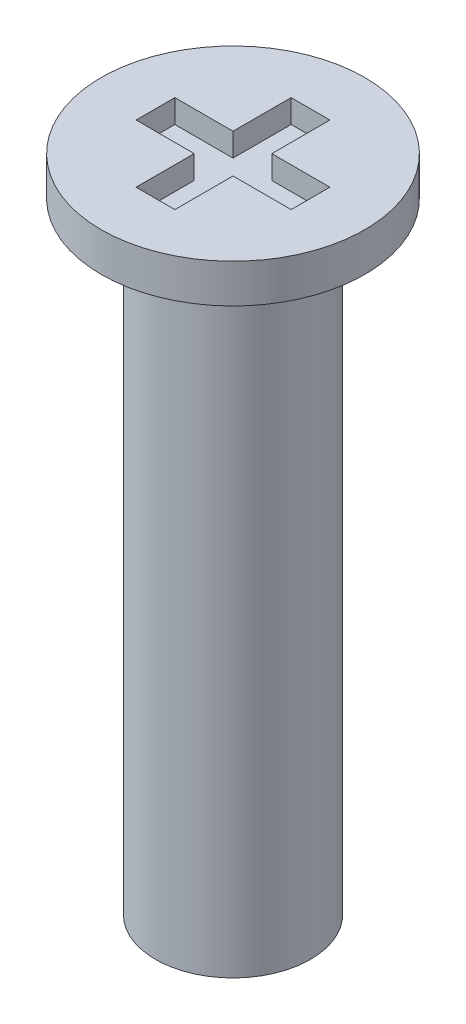
ISO-10303-21;
HEADER;
FILE_DESCRIPTION(('STEP AP214'),'2;1');
FILE_NAME('part.step','',(''),(''),'','','');
FILE_SCHEMA(('AUTOMOTIVE_DESIGN { 1 0 10303 214 1 1 1 1 }'));
ENDSEC;
DATA;
#1=APPLICATION_CONTEXT('core data for automotive mechanical design processes');
#2=APPLICATION_PROTOCOL_DEFINITION('international standard','automotive_design',2000,#1);
#3=PRODUCT_CONTEXT('',#1,'mechanical');
#4=PRODUCT('Part','Part','',(#3));
#5=PRODUCT_RELATED_PRODUCT_CATEGORY('part','',(#4));
#6=PRODUCT_DEFINITION_FORMATION('','',#4);
#7=PRODUCT_DEFINITION_CONTEXT('part definition',#1,'design');
#8=PRODUCT_DEFINITION('design','',#6,#7);
#9=PRODUCT_DEFINITION_SHAPE('','',#8);
#10=(LENGTH_UNIT() NAMED_UNIT(*) SI_UNIT(.MILLI.,.METRE.));
#11=(NAMED_UNIT(*) PLANE_ANGLE_UNIT() SI_UNIT($,.RADIAN.));
#12=(NAMED_UNIT(*) SI_UNIT($,.STERADIAN.) SOLID_ANGLE_UNIT());
#13=UNCERTAINTY_MEASURE_WITH_UNIT(LENGTH_MEASURE(1.E-05),#10,'distance_accuracy_value','');
#14=(GEOMETRIC_REPRESENTATION_CONTEXT(3) GLOBAL_UNCERTAINTY_ASSIGNED_CONTEXT((#13)) GLOBAL_UNIT_ASSIGNED_CONTEXT((#10,
#11,#12)) REPRESENTATION_CONTEXT('',''));
#15=CARTESIAN_POINT('',(0.,0.,0.));
#16=DIRECTION('',(0.,0.,1.));
#17=DIRECTION('',(1.,0.,0.));
#18=AXIS2_PLACEMENT_3D('',#15,#16,#17);
#19=CARTESIAN_POINT('',(0.,0.,0.));
#20=DIRECTION('',(0.,1.,0.));
#21=DIRECTION('',(0.,0.,1.));
#22=AXIS2_PLACEMENT_3D('',#19,#20,#21);
#23=PLANE('',#22);
#24=DIRECTION('',(-1.,0.,0.));
#25=VECTOR('',#24,1.);
#26=CARTESIAN_POINT('',(0.,0.,-0.25));
#27=LINE('',#26,#25);
#28=CARTESIAN_POINT('',(1.,0.,-0.249999999999997));
#29=VERTEX_POINT('',#28);
#30=CARTESIAN_POINT('',(0.25,0.,-0.249999999999999));
#31=VERTEX_POINT('',#30);
#32=EDGE_CURVE('E198',#29,#31,#27,.T.);
#33=ORIENTED_EDGE('',*,*,#32,.F.);
#34=DIRECTION('',(0.,0.,-1.));
#35=VECTOR('',#34,1.);
#36=CARTESIAN_POINT('',(1.,0.,-0.249999999999997));
#37=LINE('',#36,#35);
#38=CARTESIAN_POINT('',(0.999999999999999,0.,0.250000000000003));
#39=VERTEX_POINT('',#38);
#40=EDGE_CURVE('E144',#39,#29,#37,.T.);
#41=ORIENTED_EDGE('',*,*,#40,.F.);
#42=DIRECTION('',(1.,0.,0.));
#43=VECTOR('',#42,1.);
#44=CARTESIAN_POINT('',(0.,0.,0.25));
#45=LINE('',#44,#43);
#46=CARTESIAN_POINT('',(0.25,0.,0.250000000000003));
#47=VERTEX_POINT('',#46);
#48=EDGE_CURVE('E200',#47,#39,#45,.T.);
#49=ORIENTED_EDGE('',*,*,#48,.F.);
#50=DIRECTION('',(0.,0.,-1.));
#51=VECTOR('',#50,1.);
#52=CARTESIAN_POINT('',(0.25,0.,0.));
#53=LINE('',#52,#51);
#54=CARTESIAN_POINT('',(0.25,0.,1.));
#55=VERTEX_POINT('',#54);
#56=EDGE_CURVE('E170',#55,#47,#53,.T.);
#57=ORIENTED_EDGE('',*,*,#56,.F.);
#58=DIRECTION('',(1.,0.,0.));
#59=VECTOR('',#58,1.);
#60=CARTESIAN_POINT('',(0.25,0.,1.));
#61=LINE('',#60,#59);
#62=CARTESIAN_POINT('',(-0.25,0.,1.));
#63=VERTEX_POINT('',#62);
#64=EDGE_CURVE('E174',#63,#55,#61,.T.);
#65=ORIENTED_EDGE('',*,*,#64,.F.);
#66=DIRECTION('',(0.,0.,1.));
#67=VECTOR('',#66,1.);
#68=CARTESIAN_POINT('',(-0.25,0.,0.));
#69=LINE('',#68,#67);
#70=CARTESIAN_POINT('',(-0.25,0.,0.249999999999998));
#71=VERTEX_POINT('',#70);
#72=EDGE_CURVE('E182',#71,#63,#69,.T.);
#73=ORIENTED_EDGE('',*,*,#72,.F.);
#74=DIRECTION('',(1.,0.,0.));
#75=VECTOR('',#74,1.);
#76=CARTESIAN_POINT('',(0.,0.,0.25));
#77=LINE('',#76,#75);
#78=CARTESIAN_POINT('',(-1.,0.,0.24999999999999));
#79=VERTEX_POINT('',#78);
#80=EDGE_CURVE('E163',#79,#71,#77,.T.);
#81=ORIENTED_EDGE('',*,*,#80,.F.);
#82=DIRECTION('',(0.,0.,1.));
#83=VECTOR('',#82,1.);
#84=CARTESIAN_POINT('',(-1.,0.,0.24999999999999));
#85=LINE('',#84,#83);
#86=CARTESIAN_POINT('',(-0.999999999999997,0.,-0.25000000000001));
#87=VERTEX_POINT('',#86);
#88=EDGE_CURVE('E160',#87,#79,#85,.T.);
#89=ORIENTED_EDGE('',*,*,#88,.F.);
#90=CARTESIAN_POINT('',(-0.25,0.,-0.250000000000001));
#91=VERTEX_POINT('',#90);
#92=EDGE_CURVE('E150',#91,#87,#27,.T.);
#93=ORIENTED_EDGE('',*,*,#92,.F.);
#94=DIRECTION('',(0.,0.,1.));
#95=VECTOR('',#94,1.);
#96=CARTESIAN_POINT('',(-0.25,0.,0.));
#97=LINE('',#96,#95);
#98=CARTESIAN_POINT('',(-0.25,0.,-1.));
#99=VERTEX_POINT('',#98);
#100=EDGE_CURVE('E212',#99,#91,#97,.T.);
#101=ORIENTED_EDGE('',*,*,#100,.F.);
#102=DIRECTION('',(-1.,0.,0.));
#103=VECTOR('',#102,1.);
#104=CARTESIAN_POINT('',(-0.25,0.,-1.));
#105=LINE('',#104,#103);
#106=CARTESIAN_POINT('',(0.25,0.,-1.));
#107=VERTEX_POINT('',#106);
#108=EDGE_CURVE('E215',#107,#99,#105,.T.);
#109=ORIENTED_EDGE('',*,*,#108,.F.);
#110=DIRECTION('',(0.,0.,-1.));
#111=VECTOR('',#110,1.);
#112=CARTESIAN_POINT('',(0.25,0.,0.));
#113=LINE('',#112,#111);
#114=EDGE_CURVE('E70',#31,#107,#113,.T.);
#115=ORIENTED_EDGE('',*,*,#114,.F.);
#116=EDGE_LOOP('',(#33,#41,#49,#57,#65,#73,#81,#89,#93,#101,#109,#115));
#117=FACE_BOUND('',#116,.T.);
#118=CARTESIAN_POINT('',(0.,0.,0.));
#119=DIRECTION('',(0.,-1.,0.));
#120=DIRECTION('',(0.,0.,-1.));
#121=AXIS2_PLACEMENT_3D('',#118,#119,#120);
#122=CIRCLE('',#121,1.7);
#123=CARTESIAN_POINT('',(0.,0.,-1.7));
#124=VERTEX_POINT('',#123);
#125=EDGE_CURVE('E11',#124,#124,#122,.T.);
#126=ORIENTED_EDGE('',*,*,#125,.F.);
#127=EDGE_LOOP('',(#126));
#128=FACE_BOUND('',#127,.T.);
#129=ADVANCED_FACE('F42',(#117,#128),#23,.T.);
#130=CARTESIAN_POINT('',(0.,-8.5,0.));
#131=DIRECTION('',(0.,-1.,0.));
#132=DIRECTION('',(0.,0.,-1.));
#133=AXIS2_PLACEMENT_3D('',#130,#131,#132);
#134=CYLINDRICAL_SURFACE('',#133,1.7);
#135=ORIENTED_EDGE('',*,*,#125,.T.);
#136=EDGE_LOOP('',(#135));
#137=FACE_BOUND('',#136,.T.);
#138=CARTESIAN_POINT('',(0.,-0.5,0.));
#139=DIRECTION('',(0.,-1.,0.));
#140=DIRECTION('',(0.,0.,-1.));
#141=AXIS2_PLACEMENT_3D('',#138,#139,#140);
#142=CIRCLE('',#141,1.7);
#143=CARTESIAN_POINT('',(0.,-0.5,-1.7));
#144=VERTEX_POINT('',#143);
#145=EDGE_CURVE('E50',#144,#144,#142,.T.);
#146=ORIENTED_EDGE('',*,*,#145,.F.);
#147=EDGE_LOOP('',(#146));
#148=FACE_BOUND('',#147,.T.);
#149=ADVANCED_FACE('F237',(#137,#148),#134,.T.);
#150=CARTESIAN_POINT('',(1.7,-0.5,0.));
#151=DIRECTION('',(0.,-1.,0.));
#152=DIRECTION('',(0.,0.,-1.));
#153=AXIS2_PLACEMENT_3D('',#150,#151,#152);
#154=PLANE('',#153);
#155=ORIENTED_EDGE('',*,*,#145,.T.);
#156=EDGE_LOOP('',(#155));
#157=FACE_BOUND('',#156,.T.);
#158=CARTESIAN_POINT('',(0.,-0.5,0.));
#159=DIRECTION('',(0.,-1.,0.));
#160=DIRECTION('',(0.,0.,-1.));
#161=AXIS2_PLACEMENT_3D('',#158,#159,#160);
#162=CIRCLE('',#161,1.);
#163=CARTESIAN_POINT('',(0.,-0.5,-1.));
#164=VERTEX_POINT('',#163);
#165=EDGE_CURVE('E229',#164,#164,#162,.T.);
#166=ORIENTED_EDGE('',*,*,#165,.F.);
#167=EDGE_LOOP('',(#166));
#168=FACE_BOUND('',#167,.T.);
#169=ADVANCED_FACE('F234',(#157,#168),#154,.T.);
#170=CARTESIAN_POINT('',(0.,-8.5,0.));
#171=DIRECTION('',(0.,-1.,0.));
#172=DIRECTION('',(0.,0.,-1.));
#173=AXIS2_PLACEMENT_3D('',#170,#171,#172);
#174=CYLINDRICAL_SURFACE('',#173,1.);
#175=ORIENTED_EDGE('',*,*,#165,.T.);
#176=EDGE_LOOP('',(#175));
#177=FACE_BOUND('',#176,.T.);
#178=CARTESIAN_POINT('',(0.,-8.5,0.));
#179=DIRECTION('',(0.,-1.,0.));
#180=DIRECTION('',(0.,0.,-1.));
#181=AXIS2_PLACEMENT_3D('',#178,#179,#180);
#182=CIRCLE('',#181,1.);
#183=CARTESIAN_POINT('',(0.,-8.5,-1.));
#184=VERTEX_POINT('',#183);
#185=EDGE_CURVE('E225',#184,#184,#182,.T.);
#186=ORIENTED_EDGE('',*,*,#185,.F.);
#187=EDGE_LOOP('',(#186));
#188=FACE_BOUND('',#187,.T.);
#189=ADVANCED_FACE('F244',(#177,#188),#174,.T.);
#190=CARTESIAN_POINT('',(1.,-8.5,0.));
#191=DIRECTION('',(0.,-1.,0.));
#192=DIRECTION('',(0.,0.,-1.));
#193=AXIS2_PLACEMENT_3D('',#190,#191,#192);
#194=PLANE('',#193);
#195=ORIENTED_EDGE('',*,*,#185,.T.);
#196=EDGE_LOOP('',(#195));
#197=FACE_BOUND('',#196,.T.);
#198=ADVANCED_FACE('F250',(#197),#194,.T.);
#199=CARTESIAN_POINT('',(-0.25,-0.3,0.));
#200=DIRECTION('',(-1.,0.,0.));
#201=DIRECTION('',(0.,-1.,0.));
#202=AXIS2_PLACEMENT_3D('',#199,#200,#201);
#203=PLANE('',#202);
#204=ORIENTED_EDGE('',*,*,#100,.T.);
#205=DIRECTION('',(0.,-1.,0.));
#206=VECTOR('',#205,1.);
#207=CARTESIAN_POINT('',(-0.25,-0.3,-0.250000000000001));
#208=LINE('',#207,#206);
#209=CARTESIAN_POINT('',(-0.25,-0.3,-0.250000000000001));
#210=VERTEX_POINT('',#209);
#211=EDGE_CURVE('E210',#91,#210,#208,.T.);
#212=ORIENTED_EDGE('',*,*,#211,.T.);
#213=DIRECTION('',(0.,0.,1.));
#214=VECTOR('',#213,1.);
#215=CARTESIAN_POINT('',(-0.25,-0.3,0.));
#216=LINE('',#215,#214);
#217=CARTESIAN_POINT('',(-0.25,-0.3,-1.));
#218=VERTEX_POINT('',#217);
#219=EDGE_CURVE('E142',#218,#210,#216,.T.);
#220=ORIENTED_EDGE('',*,*,#219,.F.);
#221=DIRECTION('',(0.,1.,0.));
#222=VECTOR('',#221,1.);
#223=CARTESIAN_POINT('',(-0.25,-0.3,-1.));
#224=LINE('',#223,#222);
#225=EDGE_CURVE('E58',#218,#99,#224,.T.);
#226=ORIENTED_EDGE('',*,*,#225,.T.);
#227=EDGE_LOOP('',(#204,#212,#220,#226));
#228=FACE_BOUND('',#227,.T.);
#229=ADVANCED_FACE('F254',(#228),#203,.F.);
#230=CARTESIAN_POINT('',(-0.25,-0.3,-1.));
#231=DIRECTION('',(0.,0.,-1.));
#232=DIRECTION('',(-1.,0.,0.));
#233=AXIS2_PLACEMENT_3D('',#230,#231,#232);
#234=PLANE('',#233);
#235=ORIENTED_EDGE('',*,*,#108,.T.);
#236=ORIENTED_EDGE('',*,*,#225,.F.);
#237=DIRECTION('',(-1.,0.,0.));
#238=VECTOR('',#237,1.);
#239=CARTESIAN_POINT('',(-0.25,-0.3,-1.));
#240=LINE('',#239,#238);
#241=CARTESIAN_POINT('',(0.25,-0.3,-1.));
#242=VERTEX_POINT('',#241);
#243=EDGE_CURVE('E217',#242,#218,#240,.T.);
#244=ORIENTED_EDGE('',*,*,#243,.F.);
#245=DIRECTION('',(0.,1.,0.));
#246=VECTOR('',#245,1.);
#247=CARTESIAN_POINT('',(0.25,-0.3,-1.));
#248=LINE('',#247,#246);
#249=EDGE_CURVE('E219',#242,#107,#248,.T.);
#250=ORIENTED_EDGE('',*,*,#249,.T.);
#251=EDGE_LOOP('',(#235,#236,#244,#250));
#252=FACE_BOUND('',#251,.T.);
#253=ADVANCED_FACE('F258',(#252),#234,.F.);
#254=CARTESIAN_POINT('',(0.25,-0.3,0.));
#255=DIRECTION('',(1.,0.,0.));
#256=DIRECTION('',(0.,1.,0.));
#257=AXIS2_PLACEMENT_3D('',#254,#255,#256);
#258=PLANE('',#257);
#259=DIRECTION('',(0.,0.,-1.));
#260=VECTOR('',#259,1.);
#261=CARTESIAN_POINT('',(0.25,-0.3,0.));
#262=LINE('',#261,#260);
#263=CARTESIAN_POINT('',(0.25,-0.3,-0.249999999999999));
#264=VERTEX_POINT('',#263);
#265=EDGE_CURVE('E214',#264,#242,#262,.T.);
#266=ORIENTED_EDGE('',*,*,#265,.F.);
#267=DIRECTION('',(0.,1.,0.));
#268=VECTOR('',#267,1.);
#269=CARTESIAN_POINT('',(0.25,-0.3,-0.249999999999999));
#270=LINE('',#269,#268);
#271=EDGE_CURVE('E206',#264,#31,#270,.T.);
#272=ORIENTED_EDGE('',*,*,#271,.T.);
#273=ORIENTED_EDGE('',*,*,#114,.T.);
#274=ORIENTED_EDGE('',*,*,#249,.F.);
#275=EDGE_LOOP('',(#266,#272,#273,#274));
#276=FACE_BOUND('',#275,.T.);
#277=ADVANCED_FACE('F260',(#276),#258,.F.);
#278=CARTESIAN_POINT('',(0.,-0.3,0.));
#279=DIRECTION('',(0.,-1.,0.));
#280=DIRECTION('',(1.,0.,0.));
#281=AXIS2_PLACEMENT_3D('',#278,#279,#280);
#282=PLANE('',#281);
#283=DIRECTION('',(-1.,0.,0.));
#284=VECTOR('',#283,1.);
#285=CARTESIAN_POINT('',(0.,-0.3,-0.25));
#286=LINE('',#285,#284);
#287=CARTESIAN_POINT('',(1.,-0.3,-0.249999999999997));
#288=VERTEX_POINT('',#287);
#289=EDGE_CURVE('E143',#288,#264,#286,.T.);
#290=ORIENTED_EDGE('',*,*,#289,.T.);
#291=ORIENTED_EDGE('',*,*,#265,.T.);
#292=ORIENTED_EDGE('',*,*,#243,.T.);
#293=ORIENTED_EDGE('',*,*,#219,.T.);
#294=CARTESIAN_POINT('',(-0.999999999999997,-0.3,-0.25000000000001));
#295=VERTEX_POINT('',#294);
#296=EDGE_CURVE('E78',#210,#295,#286,.T.);
#297=ORIENTED_EDGE('',*,*,#296,.T.);
#298=DIRECTION('',(0.,0.,1.));
#299=VECTOR('',#298,1.);
#300=CARTESIAN_POINT('',(-1.,-0.3,0.24999999999999));
#301=LINE('',#300,#299);
#302=CARTESIAN_POINT('',(-1.,-0.3,0.24999999999999));
#303=VERTEX_POINT('',#302);
#304=EDGE_CURVE('E140',#295,#303,#301,.T.);
#305=ORIENTED_EDGE('',*,*,#304,.T.);
#306=DIRECTION('',(1.,0.,0.));
#307=VECTOR('',#306,1.);
#308=CARTESIAN_POINT('',(0.,-0.3,0.25));
#309=LINE('',#308,#307);
#310=CARTESIAN_POINT('',(-0.25,-0.3,0.249999999999998));
#311=VERTEX_POINT('',#310);
#312=EDGE_CURVE('E158',#303,#311,#309,.T.);
#313=ORIENTED_EDGE('',*,*,#312,.T.);
#314=DIRECTION('',(0.,0.,1.));
#315=VECTOR('',#314,1.);
#316=CARTESIAN_POINT('',(-0.25,-0.3,0.));
#317=LINE('',#316,#315);
#318=CARTESIAN_POINT('',(-0.25,-0.3,1.));
#319=VERTEX_POINT('',#318);
#320=EDGE_CURVE('E173',#311,#319,#317,.T.);
#321=ORIENTED_EDGE('',*,*,#320,.T.);
#322=DIRECTION('',(1.,0.,0.));
#323=VECTOR('',#322,1.);
#324=CARTESIAN_POINT('',(0.25,-0.3,1.));
#325=LINE('',#324,#323);
#326=CARTESIAN_POINT('',(0.25,-0.3,1.));
#327=VERTEX_POINT('',#326);
#328=EDGE_CURVE('E176',#319,#327,#325,.T.);
#329=ORIENTED_EDGE('',*,*,#328,.T.);
#330=DIRECTION('',(0.,0.,-1.));
#331=VECTOR('',#330,1.);
#332=CARTESIAN_POINT('',(0.25,-0.3,0.));
#333=LINE('',#332,#331);
#334=CARTESIAN_POINT('',(0.25,-0.3,0.250000000000003));
#335=VERTEX_POINT('',#334);
#336=EDGE_CURVE('E171',#327,#335,#333,.T.);
#337=ORIENTED_EDGE('',*,*,#336,.T.);
#338=DIRECTION('',(1.,0.,0.));
#339=VECTOR('',#338,1.);
#340=CARTESIAN_POINT('',(0.,-0.3,0.25));
#341=LINE('',#340,#339);
#342=CARTESIAN_POINT('',(0.999999999999999,-0.3,0.250000000000003));
#343=VERTEX_POINT('',#342);
#344=EDGE_CURVE('E192',#335,#343,#341,.T.);
#345=ORIENTED_EDGE('',*,*,#344,.T.);
#346=DIRECTION('',(0.,0.,-1.));
#347=VECTOR('',#346,1.);
#348=CARTESIAN_POINT('',(1.,-0.3,-0.249999999999997));
#349=LINE('',#348,#347);
#350=EDGE_CURVE('E194',#343,#288,#349,.T.);
#351=ORIENTED_EDGE('',*,*,#350,.T.);
#352=EDGE_LOOP('',(#290,#291,#292,#293,#297,#305,#313,#321,#329,#337,#345,#351));
#353=FACE_BOUND('',#352,.T.);
#354=ADVANCED_FACE('F138',(#353),#282,.F.);
#355=CARTESIAN_POINT('',(0.,-0.3,-0.25));
#356=DIRECTION('',(0.,0.,-1.));
#357=DIRECTION('',(-1.,0.,0.));
#358=AXIS2_PLACEMENT_3D('',#355,#356,#357);
#359=PLANE('',#358);
#360=ORIENTED_EDGE('',*,*,#92,.T.);
#361=DIRECTION('',(0.,1.,0.));
#362=VECTOR('',#361,1.);
#363=CARTESIAN_POINT('',(-0.999999999999997,-0.3,-0.25000000000001));
#364=LINE('',#363,#362);
#365=EDGE_CURVE('E147',#295,#87,#364,.T.);
#366=ORIENTED_EDGE('',*,*,#365,.F.);
#367=ORIENTED_EDGE('',*,*,#296,.F.);
#368=ORIENTED_EDGE('',*,*,#211,.F.);
#369=EDGE_LOOP('',(#360,#366,#367,#368));
#370=FACE_BOUND('',#369,.T.);
#371=ADVANCED_FACE('F148',(#370),#359,.F.);
#372=ORIENTED_EDGE('',*,*,#289,.F.);
#373=DIRECTION('',(0.,1.,0.));
#374=VECTOR('',#373,1.);
#375=CARTESIAN_POINT('',(1.,-0.3,-0.249999999999997));
#376=LINE('',#375,#374);
#377=EDGE_CURVE('E204',#288,#29,#376,.T.);
#378=ORIENTED_EDGE('',*,*,#377,.T.);
#379=ORIENTED_EDGE('',*,*,#32,.T.);
#380=ORIENTED_EDGE('',*,*,#271,.F.);
#381=EDGE_LOOP('',(#372,#378,#379,#380));
#382=FACE_BOUND('',#381,.T.);
#383=ADVANCED_FACE('F269',(#382),#359,.F.);
#384=CARTESIAN_POINT('',(1.,-0.3,-0.249999999999997));
#385=DIRECTION('',(1.,0.,0.));
#386=DIRECTION('',(0.,0.,-1.));
#387=AXIS2_PLACEMENT_3D('',#384,#385,#386);
#388=PLANE('',#387);
#389=ORIENTED_EDGE('',*,*,#40,.T.);
#390=ORIENTED_EDGE('',*,*,#377,.F.);
#391=ORIENTED_EDGE('',*,*,#350,.F.);
#392=DIRECTION('',(0.,1.,0.));
#393=VECTOR('',#392,1.);
#394=CARTESIAN_POINT('',(0.999999999999999,-0.3,0.250000000000003));
#395=LINE('',#394,#393);
#396=EDGE_CURVE('E197',#343,#39,#395,.T.);
#397=ORIENTED_EDGE('',*,*,#396,.T.);
#398=EDGE_LOOP('',(#389,#390,#391,#397));
#399=FACE_BOUND('',#398,.T.);
#400=ADVANCED_FACE('F274',(#399),#388,.F.);
#401=CARTESIAN_POINT('',(0.,-0.3,0.25));
#402=DIRECTION('',(0.,0.,1.));
#403=DIRECTION('',(1.,0.,0.));
#404=AXIS2_PLACEMENT_3D('',#401,#402,#403);
#405=PLANE('',#404);
#406=DIRECTION('',(0.,1.,0.));
#407=VECTOR('',#406,1.);
#408=CARTESIAN_POINT('',(0.25,-0.3,0.250000000000001));
#409=LINE('',#408,#407);
#410=EDGE_CURVE('E188',#335,#47,#409,.T.);
#411=ORIENTED_EDGE('',*,*,#410,.T.);
#412=ORIENTED_EDGE('',*,*,#48,.T.);
#413=ORIENTED_EDGE('',*,*,#396,.F.);
#414=ORIENTED_EDGE('',*,*,#344,.F.);
#415=EDGE_LOOP('',(#411,#412,#413,#414));
#416=FACE_BOUND('',#415,.T.);
#417=ADVANCED_FACE('F270',(#416),#405,.F.);
#418=CARTESIAN_POINT('',(0.25,-0.3,0.));
#419=DIRECTION('',(1.,0.,0.));
#420=DIRECTION('',(0.,1.,0.));
#421=AXIS2_PLACEMENT_3D('',#418,#419,#420);
#422=PLANE('',#421);
#423=ORIENTED_EDGE('',*,*,#336,.F.);
#424=DIRECTION('',(0.,1.,0.));
#425=VECTOR('',#424,1.);
#426=CARTESIAN_POINT('',(0.25,-0.3,1.));
#427=LINE('',#426,#425);
#428=EDGE_CURVE('E186',#327,#55,#427,.T.);
#429=ORIENTED_EDGE('',*,*,#428,.T.);
#430=ORIENTED_EDGE('',*,*,#56,.T.);
#431=ORIENTED_EDGE('',*,*,#410,.F.);
#432=EDGE_LOOP('',(#423,#429,#430,#431));
#433=FACE_BOUND('',#432,.T.);
#434=ADVANCED_FACE('F273',(#433),#422,.F.);
#435=CARTESIAN_POINT('',(0.25,-0.3,1.));
#436=DIRECTION('',(0.,0.,1.));
#437=DIRECTION('',(1.,0.,0.));
#438=AXIS2_PLACEMENT_3D('',#435,#436,#437);
#439=PLANE('',#438);
#440=ORIENTED_EDGE('',*,*,#64,.T.);
#441=ORIENTED_EDGE('',*,*,#428,.F.);
#442=ORIENTED_EDGE('',*,*,#328,.F.);
#443=DIRECTION('',(0.,1.,0.));
#444=VECTOR('',#443,1.);
#445=CARTESIAN_POINT('',(-0.25,-0.3,1.));
#446=LINE('',#445,#444);
#447=EDGE_CURVE('E179',#319,#63,#446,.T.);
#448=ORIENTED_EDGE('',*,*,#447,.T.);
#449=EDGE_LOOP('',(#440,#441,#442,#448));
#450=FACE_BOUND('',#449,.T.);
#451=ADVANCED_FACE('F281',(#450),#439,.F.);
#452=CARTESIAN_POINT('',(-0.25,-0.3,0.));
#453=DIRECTION('',(-1.,0.,0.));
#454=DIRECTION('',(0.,-1.,0.));
#455=AXIS2_PLACEMENT_3D('',#452,#453,#454);
#456=PLANE('',#455);
#457=DIRECTION('',(0.,1.,0.));
#458=VECTOR('',#457,1.);
#459=CARTESIAN_POINT('',(-0.25,-0.3,0.249999999999998));
#460=LINE('',#459,#458);
#461=EDGE_CURVE('E167',#311,#71,#460,.T.);
#462=ORIENTED_EDGE('',*,*,#461,.T.);
#463=ORIENTED_EDGE('',*,*,#72,.T.);
#464=ORIENTED_EDGE('',*,*,#447,.F.);
#465=ORIENTED_EDGE('',*,*,#320,.F.);
#466=EDGE_LOOP('',(#462,#463,#464,#465));
#467=FACE_BOUND('',#466,.T.);
#468=ADVANCED_FACE('F283',(#467),#456,.F.);
#469=CARTESIAN_POINT('',(0.,-0.3,0.25));
#470=DIRECTION('',(0.,0.,1.));
#471=DIRECTION('',(1.,0.,0.));
#472=AXIS2_PLACEMENT_3D('',#469,#470,#471);
#473=PLANE('',#472);
#474=ORIENTED_EDGE('',*,*,#312,.F.);
#475=DIRECTION('',(0.,1.,0.));
#476=VECTOR('',#475,1.);
#477=CARTESIAN_POINT('',(-1.,-0.3,0.24999999999999));
#478=LINE('',#477,#476);
#479=EDGE_CURVE('E154',#303,#79,#478,.T.);
#480=ORIENTED_EDGE('',*,*,#479,.T.);
#481=ORIENTED_EDGE('',*,*,#80,.T.);
#482=ORIENTED_EDGE('',*,*,#461,.F.);
#483=EDGE_LOOP('',(#474,#480,#481,#482));
#484=FACE_BOUND('',#483,.T.);
#485=ADVANCED_FACE('F286',(#484),#473,.F.);
#486=CARTESIAN_POINT('',(-1.,-0.3,0.24999999999999));
#487=DIRECTION('',(-1.,0.,0.));
#488=DIRECTION('',(0.,0.,1.));
#489=AXIS2_PLACEMENT_3D('',#486,#487,#488);
#490=PLANE('',#489);
#491=ORIENTED_EDGE('',*,*,#88,.T.);
#492=ORIENTED_EDGE('',*,*,#479,.F.);
#493=ORIENTED_EDGE('',*,*,#304,.F.);
#494=ORIENTED_EDGE('',*,*,#365,.T.);
#495=EDGE_LOOP('',(#491,#492,#493,#494));
#496=FACE_BOUND('',#495,.T.);
#497=ADVANCED_FACE('F156',(#496),#490,.F.);
#498=CLOSED_SHELL('',(#129,#149,#169,#189,#198,#229,#253,#277,#354,#371,#383,#400,#417,#434,
#451,#468,#485,#497));
#499=MANIFOLD_SOLID_BREP('B2',#498);
#500=ADVANCED_BREP_SHAPE_REPRESENTATION('',(#18,#499),#14);
#501=SHAPE_DEFINITION_REPRESENTATION(#9,#500);
ENDSEC;
END-ISO-10303-21;
